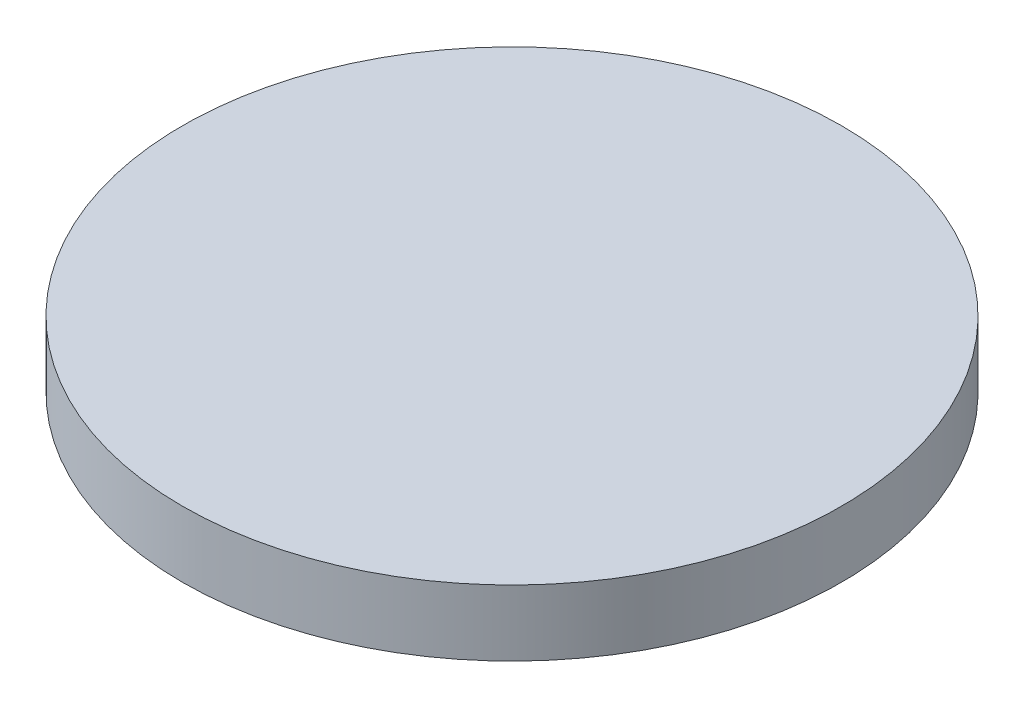
ISO-10303-21;
HEADER;
FILE_DESCRIPTION(('STEP AP214'),'2;1');
FILE_NAME('part.step','',(''),(''),'','','');
FILE_SCHEMA(('AUTOMOTIVE_DESIGN { 1 0 10303 214 1 1 1 1 }'));
ENDSEC;
DATA;
#1=APPLICATION_CONTEXT('core data for automotive mechanical design processes');
#2=APPLICATION_PROTOCOL_DEFINITION('international standard','automotive_design',2000,#1);
#3=PRODUCT_CONTEXT('',#1,'mechanical');
#4=PRODUCT('Part','Part','',(#3));
#5=PRODUCT_RELATED_PRODUCT_CATEGORY('part','',(#4));
#6=PRODUCT_DEFINITION_FORMATION('','',#4);
#7=PRODUCT_DEFINITION_CONTEXT('part definition',#1,'design');
#8=PRODUCT_DEFINITION('design','',#6,#7);
#9=PRODUCT_DEFINITION_SHAPE('','',#8);
#10=(LENGTH_UNIT() NAMED_UNIT(*) SI_UNIT(.MILLI.,.METRE.));
#11=(NAMED_UNIT(*) PLANE_ANGLE_UNIT() SI_UNIT($,.RADIAN.));
#12=(NAMED_UNIT(*) SI_UNIT($,.STERADIAN.) SOLID_ANGLE_UNIT());
#13=UNCERTAINTY_MEASURE_WITH_UNIT(LENGTH_MEASURE(1.E-05),#10,'distance_accuracy_value','');
#14=(GEOMETRIC_REPRESENTATION_CONTEXT(3) GLOBAL_UNCERTAINTY_ASSIGNED_CONTEXT((#13)) GLOBAL_UNIT_ASSIGNED_CONTEXT((#10,
#11,#12)) REPRESENTATION_CONTEXT('',''));
#15=CARTESIAN_POINT('',(0.,0.,0.));
#16=DIRECTION('',(0.,0.,1.));
#17=DIRECTION('',(1.,0.,0.));
#18=AXIS2_PLACEMENT_3D('',#15,#16,#17);
#19=CARTESIAN_POINT('',(0.,10.,0.));
#20=DIRECTION('',(0.,-1.,0.));
#21=DIRECTION('',(0.,0.,-1.));
#22=AXIS2_PLACEMENT_3D('',#19,#20,#21);
#23=CYLINDRICAL_SURFACE('',#22,50.);
#24=CARTESIAN_POINT('',(0.,10.,0.));
#25=DIRECTION('',(0.,1.,0.));
#26=DIRECTION('',(0.,0.,1.));
#27=AXIS2_PLACEMENT_3D('',#24,#25,#26);
#28=CIRCLE('',#27,50.);
#29=CARTESIAN_POINT('',(0.,10.,50.));
#30=VERTEX_POINT('',#29);
#31=EDGE_CURVE('E10',#30,#30,#28,.T.);
#32=ORIENTED_EDGE('',*,*,#31,.F.);
#33=EDGE_LOOP('',(#32));
#34=FACE_BOUND('',#33,.T.);
#35=CARTESIAN_POINT('',(0.,0.,0.));
#36=DIRECTION('',(0.,1.,0.));
#37=DIRECTION('',(0.,0.,1.));
#38=AXIS2_PLACEMENT_3D('',#35,#36,#37);
#39=CIRCLE('',#38,50.);
#40=CARTESIAN_POINT('',(0.,0.,50.));
#41=VERTEX_POINT('',#40);
#42=EDGE_CURVE('E44',#41,#41,#39,.T.);
#43=ORIENTED_EDGE('',*,*,#42,.T.);
#44=EDGE_LOOP('',(#43));
#45=FACE_BOUND('',#44,.T.);
#46=ADVANCED_FACE('F41',(#34,#45),#23,.T.);
#47=CARTESIAN_POINT('',(0.,10.,0.));
#48=DIRECTION('',(0.,1.,0.));
#49=DIRECTION('',(0.,0.,1.));
#50=AXIS2_PLACEMENT_3D('',#47,#48,#49);
#51=PLANE('',#50);
#52=ORIENTED_EDGE('',*,*,#31,.T.);
#53=EDGE_LOOP('',(#52));
#54=FACE_BOUND('',#53,.T.);
#55=ADVANCED_FACE('F56',(#54),#51,.T.);
#56=CARTESIAN_POINT('',(0.,0.,0.));
#57=DIRECTION('',(0.,1.,0.));
#58=DIRECTION('',(0.,0.,1.));
#59=AXIS2_PLACEMENT_3D('',#56,#57,#58);
#60=PLANE('',#59);
#61=ORIENTED_EDGE('',*,*,#42,.F.);
#62=EDGE_LOOP('',(#61));
#63=FACE_BOUND('',#62,.T.);
#64=ADVANCED_FACE('F54',(#63),#60,.F.);
#65=CLOSED_SHELL('',(#46,#55,#64));
#66=MANIFOLD_SOLID_BREP('B2',#65);
#67=ADVANCED_BREP_SHAPE_REPRESENTATION('',(#18,#66),#14);
#68=SHAPE_DEFINITION_REPRESENTATION(#9,#67);
ENDSEC;
END-ISO-10303-21;
